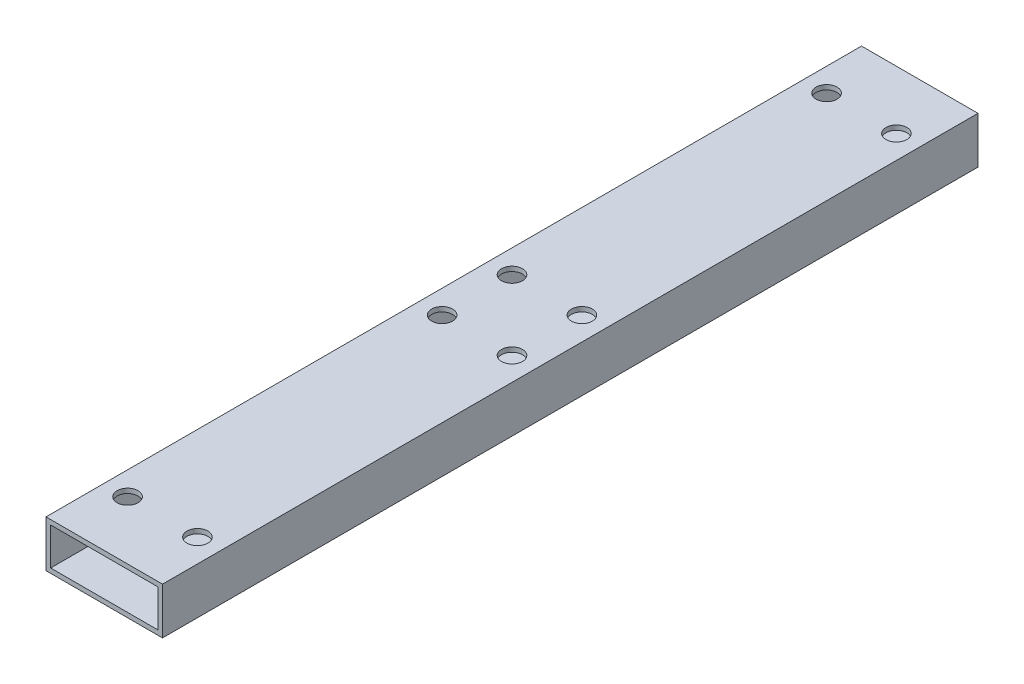
ISO-10303-21;
HEADER;
FILE_DESCRIPTION(('STEP AP214'),'2;1');
FILE_NAME('part.step','',(''),(''),'','','');
FILE_SCHEMA(('AUTOMOTIVE_DESIGN { 1 0 10303 214 1 1 1 1 }'));
ENDSEC;
DATA;
#1=APPLICATION_CONTEXT('core data for automotive mechanical design processes');
#2=APPLICATION_PROTOCOL_DEFINITION('international standard','automotive_design',2000,#1);
#3=PRODUCT_CONTEXT('',#1,'mechanical');
#4=PRODUCT('Part','Part','',(#3));
#5=PRODUCT_RELATED_PRODUCT_CATEGORY('part','',(#4));
#6=PRODUCT_DEFINITION_FORMATION('','',#4);
#7=PRODUCT_DEFINITION_CONTEXT('part definition',#1,'design');
#8=PRODUCT_DEFINITION('design','',#6,#7);
#9=PRODUCT_DEFINITION_SHAPE('','',#8);
#10=(LENGTH_UNIT() NAMED_UNIT(*) SI_UNIT(.MILLI.,.METRE.));
#11=(NAMED_UNIT(*) PLANE_ANGLE_UNIT() SI_UNIT($,.RADIAN.));
#12=(NAMED_UNIT(*) SI_UNIT($,.STERADIAN.) SOLID_ANGLE_UNIT());
#13=UNCERTAINTY_MEASURE_WITH_UNIT(LENGTH_MEASURE(1.E-05),#10,'distance_accuracy_value','');
#14=(GEOMETRIC_REPRESENTATION_CONTEXT(3) GLOBAL_UNCERTAINTY_ASSIGNED_CONTEXT((#13)) GLOBAL_UNIT_ASSIGNED_CONTEXT((#10,
#11,#12)) REPRESENTATION_CONTEXT('',''));
#15=CARTESIAN_POINT('',(0.,0.,0.));
#16=DIRECTION('',(0.,0.,1.));
#17=DIRECTION('',(1.,0.,0.));
#18=AXIS2_PLACEMENT_3D('',#15,#16,#17);
#19=CARTESIAN_POINT('',(25.,-10.,350.));
#20=DIRECTION('',(-1.,0.,0.));
#21=DIRECTION('',(0.,0.,1.));
#22=AXIS2_PLACEMENT_3D('',#19,#20,#21);
#23=PLANE('',#22);
#24=DIRECTION('',(0.,1.,0.));
#25=VECTOR('',#24,1.);
#26=CARTESIAN_POINT('',(25.,-10.,0.));
#27=LINE('',#26,#25);
#28=CARTESIAN_POINT('',(25.,-10.,0.));
#29=VERTEX_POINT('',#28);
#30=CARTESIAN_POINT('',(25.,10.,0.));
#31=VERTEX_POINT('',#30);
#32=EDGE_CURVE('E135',#29,#31,#27,.T.);
#33=ORIENTED_EDGE('',*,*,#32,.T.);
#34=DIRECTION('',(0.,0.,-1.));
#35=VECTOR('',#34,1.);
#36=CARTESIAN_POINT('',(25.,10.,350.));
#37=LINE('',#36,#35);
#38=CARTESIAN_POINT('',(25.,10.,350.));
#39=VERTEX_POINT('',#38);
#40=EDGE_CURVE('E11',#39,#31,#37,.T.);
#41=ORIENTED_EDGE('',*,*,#40,.F.);
#42=DIRECTION('',(0.,1.,0.));
#43=VECTOR('',#42,1.);
#44=CARTESIAN_POINT('',(25.,-10.,350.));
#45=LINE('',#44,#43);
#46=CARTESIAN_POINT('',(25.,-10.,350.));
#47=VERTEX_POINT('',#46);
#48=EDGE_CURVE('E139',#47,#39,#45,.T.);
#49=ORIENTED_EDGE('',*,*,#48,.F.);
#50=DIRECTION('',(0.,0.,-1.));
#51=VECTOR('',#50,1.);
#52=CARTESIAN_POINT('',(25.,-10.,350.));
#53=LINE('',#52,#51);
#54=EDGE_CURVE('E149',#47,#29,#53,.T.);
#55=ORIENTED_EDGE('',*,*,#54,.T.);
#56=EDGE_LOOP('',(#33,#41,#49,#55));
#57=FACE_BOUND('',#56,.T.);
#58=ADVANCED_FACE('F33',(#57),#23,.F.);
#59=CARTESIAN_POINT('',(-25.,10.,350.));
#60=DIRECTION('',(0.,-1.,0.));
#61=DIRECTION('',(0.,0.,-1.));
#62=AXIS2_PLACEMENT_3D('',#59,#60,#61);
#63=PLANE('',#62);
#64=CARTESIAN_POINT('',(-15.,10.,160.));
#65=DIRECTION('',(0.,1.,0.));
#66=DIRECTION('',(0.,0.,1.));
#67=AXIS2_PLACEMENT_3D('',#64,#65,#66);
#68=CIRCLE('',#67,4.5);
#69=CARTESIAN_POINT('',(-15.,10.,164.5));
#70=VERTEX_POINT('',#69);
#71=EDGE_CURVE('E513',#70,#70,#68,.T.);
#72=ORIENTED_EDGE('',*,*,#71,.F.);
#73=EDGE_LOOP('',(#72));
#74=FACE_BOUND('',#73,.T.);
#75=CARTESIAN_POINT('',(-15.,10.,190.));
#76=DIRECTION('',(0.,1.,0.));
#77=DIRECTION('',(0.,0.,1.));
#78=AXIS2_PLACEMENT_3D('',#75,#76,#77);
#79=CIRCLE('',#78,4.5);
#80=CARTESIAN_POINT('',(-15.,10.,194.5));
#81=VERTEX_POINT('',#80);
#82=EDGE_CURVE('E202',#81,#81,#79,.T.);
#83=ORIENTED_EDGE('',*,*,#82,.F.);
#84=EDGE_LOOP('',(#83));
#85=FACE_BOUND('',#84,.T.);
#86=CARTESIAN_POINT('',(15.,10.,190.));
#87=DIRECTION('',(0.,1.,0.));
#88=DIRECTION('',(0.,0.,1.));
#89=AXIS2_PLACEMENT_3D('',#86,#87,#88);
#90=CIRCLE('',#89,4.5);
#91=CARTESIAN_POINT('',(15.,10.,194.5));
#92=VERTEX_POINT('',#91);
#93=EDGE_CURVE('E199',#92,#92,#90,.T.);
#94=ORIENTED_EDGE('',*,*,#93,.F.);
#95=EDGE_LOOP('',(#94));
#96=FACE_BOUND('',#95,.T.);
#97=CARTESIAN_POINT('',(15.,10.,160.));
#98=DIRECTION('',(0.,1.,0.));
#99=DIRECTION('',(0.,0.,1.));
#100=AXIS2_PLACEMENT_3D('',#97,#98,#99);
#101=CIRCLE('',#100,4.5);
#102=CARTESIAN_POINT('',(15.,10.,164.5));
#103=VERTEX_POINT('',#102);
#104=EDGE_CURVE('E218',#103,#103,#101,.T.);
#105=ORIENTED_EDGE('',*,*,#104,.F.);
#106=EDGE_LOOP('',(#105));
#107=FACE_BOUND('',#106,.T.);
#108=CARTESIAN_POINT('',(-15.,10.,25.));
#109=DIRECTION('',(0.,1.,0.));
#110=DIRECTION('',(0.,0.,1.));
#111=AXIS2_PLACEMENT_3D('',#108,#109,#110);
#112=CIRCLE('',#111,4.5);
#113=CARTESIAN_POINT('',(-15.,10.,29.5));
#114=VERTEX_POINT('',#113);
#115=EDGE_CURVE('E225',#114,#114,#112,.T.);
#116=ORIENTED_EDGE('',*,*,#115,.F.);
#117=EDGE_LOOP('',(#116));
#118=FACE_BOUND('',#117,.T.);
#119=CARTESIAN_POINT('',(15.,10.,25.));
#120=DIRECTION('',(0.,1.,0.));
#121=DIRECTION('',(0.,0.,1.));
#122=AXIS2_PLACEMENT_3D('',#119,#120,#121);
#123=CIRCLE('',#122,4.5);
#124=CARTESIAN_POINT('',(15.,10.,29.5));
#125=VERTEX_POINT('',#124);
#126=EDGE_CURVE('E232',#125,#125,#123,.T.);
#127=ORIENTED_EDGE('',*,*,#126,.F.);
#128=EDGE_LOOP('',(#127));
#129=FACE_BOUND('',#128,.T.);
#130=CARTESIAN_POINT('',(-15.,10.,325.));
#131=DIRECTION('',(0.,1.,0.));
#132=DIRECTION('',(0.,0.,1.));
#133=AXIS2_PLACEMENT_3D('',#130,#131,#132);
#134=CIRCLE('',#133,4.5);
#135=CARTESIAN_POINT('',(-15.,10.,329.5));
#136=VERTEX_POINT('',#135);
#137=EDGE_CURVE('E239',#136,#136,#134,.T.);
#138=ORIENTED_EDGE('',*,*,#137,.F.);
#139=EDGE_LOOP('',(#138));
#140=FACE_BOUND('',#139,.T.);
#141=CARTESIAN_POINT('',(15.,10.,325.));
#142=DIRECTION('',(0.,1.,0.));
#143=DIRECTION('',(0.,0.,1.));
#144=AXIS2_PLACEMENT_3D('',#141,#142,#143);
#145=CIRCLE('',#144,4.5);
#146=CARTESIAN_POINT('',(15.,10.,329.5));
#147=VERTEX_POINT('',#146);
#148=EDGE_CURVE('E246',#147,#147,#145,.T.);
#149=ORIENTED_EDGE('',*,*,#148,.F.);
#150=EDGE_LOOP('',(#149));
#151=FACE_BOUND('',#150,.T.);
#152=DIRECTION('',(-1.,0.,0.));
#153=VECTOR('',#152,1.);
#154=CARTESIAN_POINT('',(-25.,10.,0.));
#155=LINE('',#154,#153);
#156=CARTESIAN_POINT('',(-25.,10.,0.));
#157=VERTEX_POINT('',#156);
#158=EDGE_CURVE('E152',#31,#157,#155,.T.);
#159=ORIENTED_EDGE('',*,*,#158,.T.);
#160=DIRECTION('',(0.,0.,-1.));
#161=VECTOR('',#160,1.);
#162=CARTESIAN_POINT('',(-25.,10.,350.));
#163=LINE('',#162,#161);
#164=CARTESIAN_POINT('',(-25.,10.,350.));
#165=VERTEX_POINT('',#164);
#166=EDGE_CURVE('E41',#165,#157,#163,.T.);
#167=ORIENTED_EDGE('',*,*,#166,.F.);
#168=DIRECTION('',(-1.,0.,0.));
#169=VECTOR('',#168,1.);
#170=CARTESIAN_POINT('',(-25.,10.,350.));
#171=LINE('',#170,#169);
#172=EDGE_CURVE('E142',#39,#165,#171,.T.);
#173=ORIENTED_EDGE('',*,*,#172,.F.);
#174=ORIENTED_EDGE('',*,*,#40,.T.);
#175=EDGE_LOOP('',(#159,#167,#173,#174));
#176=FACE_BOUND('',#175,.T.);
#177=ADVANCED_FACE('F254',(#74,#85,#96,#107,#118,#129,#140,#151,#176),#63,.F.);
#178=CARTESIAN_POINT('',(-25.,-10.,350.));
#179=DIRECTION('',(1.,0.,0.));
#180=DIRECTION('',(0.,0.,-1.));
#181=AXIS2_PLACEMENT_3D('',#178,#179,#180);
#182=PLANE('',#181);
#183=DIRECTION('',(0.,-1.,0.));
#184=VECTOR('',#183,1.);
#185=CARTESIAN_POINT('',(-25.,-10.,0.));
#186=LINE('',#185,#184);
#187=CARTESIAN_POINT('',(-25.,-10.,0.));
#188=VERTEX_POINT('',#187);
#189=EDGE_CURVE('E154',#157,#188,#186,.T.);
#190=ORIENTED_EDGE('',*,*,#189,.T.);
#191=DIRECTION('',(0.,0.,-1.));
#192=VECTOR('',#191,1.);
#193=CARTESIAN_POINT('',(-25.,-10.,350.));
#194=LINE('',#193,#192);
#195=CARTESIAN_POINT('',(-25.,-10.,350.));
#196=VERTEX_POINT('',#195);
#197=EDGE_CURVE('E159',#196,#188,#194,.T.);
#198=ORIENTED_EDGE('',*,*,#197,.F.);
#199=DIRECTION('',(0.,-1.,0.));
#200=VECTOR('',#199,1.);
#201=CARTESIAN_POINT('',(-25.,-10.,350.));
#202=LINE('',#201,#200);
#203=EDGE_CURVE('E145',#165,#196,#202,.T.);
#204=ORIENTED_EDGE('',*,*,#203,.F.);
#205=ORIENTED_EDGE('',*,*,#166,.T.);
#206=EDGE_LOOP('',(#190,#198,#204,#205));
#207=FACE_BOUND('',#206,.T.);
#208=ADVANCED_FACE('F257',(#207),#182,.F.);
#209=CARTESIAN_POINT('',(-25.,-10.,350.));
#210=DIRECTION('',(0.,1.,0.));
#211=DIRECTION('',(0.,0.,1.));
#212=AXIS2_PLACEMENT_3D('',#209,#210,#211);
#213=PLANE('',#212);
#214=CARTESIAN_POINT('',(-15.,-10.,160.));
#215=DIRECTION('',(0.,1.,0.));
#216=DIRECTION('',(0.,0.,1.));
#217=AXIS2_PLACEMENT_3D('',#214,#215,#216);
#218=CIRCLE('',#217,4.5);
#219=CARTESIAN_POINT('',(-15.,-10.,164.5));
#220=VERTEX_POINT('',#219);
#221=EDGE_CURVE('E508',#220,#220,#218,.T.);
#222=ORIENTED_EDGE('',*,*,#221,.T.);
#223=EDGE_LOOP('',(#222));
#224=FACE_BOUND('',#223,.T.);
#225=CARTESIAN_POINT('',(-15.,-10.,190.));
#226=DIRECTION('',(0.,1.,0.));
#227=DIRECTION('',(0.,0.,1.));
#228=AXIS2_PLACEMENT_3D('',#225,#226,#227);
#229=CIRCLE('',#228,4.5);
#230=CARTESIAN_POINT('',(-15.,-10.,194.5));
#231=VERTEX_POINT('',#230);
#232=EDGE_CURVE('E195',#231,#231,#229,.T.);
#233=ORIENTED_EDGE('',*,*,#232,.T.);
#234=EDGE_LOOP('',(#233));
#235=FACE_BOUND('',#234,.T.);
#236=CARTESIAN_POINT('',(15.,-10.,190.));
#237=DIRECTION('',(0.,1.,0.));
#238=DIRECTION('',(0.,0.,1.));
#239=AXIS2_PLACEMENT_3D('',#236,#237,#238);
#240=CIRCLE('',#239,4.5);
#241=CARTESIAN_POINT('',(15.,-10.,194.5));
#242=VERTEX_POINT('',#241);
#243=EDGE_CURVE('E191',#242,#242,#240,.T.);
#244=ORIENTED_EDGE('',*,*,#243,.T.);
#245=EDGE_LOOP('',(#244));
#246=FACE_BOUND('',#245,.T.);
#247=CARTESIAN_POINT('',(15.,-10.,160.));
#248=DIRECTION('',(0.,1.,0.));
#249=DIRECTION('',(0.,0.,1.));
#250=AXIS2_PLACEMENT_3D('',#247,#248,#249);
#251=CIRCLE('',#250,4.5);
#252=CARTESIAN_POINT('',(15.,-10.,164.5));
#253=VERTEX_POINT('',#252);
#254=EDGE_CURVE('E187',#253,#253,#251,.T.);
#255=ORIENTED_EDGE('',*,*,#254,.T.);
#256=EDGE_LOOP('',(#255));
#257=FACE_BOUND('',#256,.T.);
#258=CARTESIAN_POINT('',(-15.,-10.,25.));
#259=DIRECTION('',(0.,1.,0.));
#260=DIRECTION('',(0.,0.,1.));
#261=AXIS2_PLACEMENT_3D('',#258,#259,#260);
#262=CIRCLE('',#261,4.5);
#263=CARTESIAN_POINT('',(-15.,-10.,29.5));
#264=VERTEX_POINT('',#263);
#265=EDGE_CURVE('E182',#264,#264,#262,.T.);
#266=ORIENTED_EDGE('',*,*,#265,.T.);
#267=EDGE_LOOP('',(#266));
#268=FACE_BOUND('',#267,.T.);
#269=CARTESIAN_POINT('',(15.,-10.,25.));
#270=DIRECTION('',(0.,1.,0.));
#271=DIRECTION('',(0.,0.,1.));
#272=AXIS2_PLACEMENT_3D('',#269,#270,#271);
#273=CIRCLE('',#272,4.5);
#274=CARTESIAN_POINT('',(15.,-10.,29.5));
#275=VERTEX_POINT('',#274);
#276=EDGE_CURVE('E177',#275,#275,#273,.T.);
#277=ORIENTED_EDGE('',*,*,#276,.T.);
#278=EDGE_LOOP('',(#277));
#279=FACE_BOUND('',#278,.T.);
#280=CARTESIAN_POINT('',(-15.,-10.,325.));
#281=DIRECTION('',(0.,1.,0.));
#282=DIRECTION('',(0.,0.,1.));
#283=AXIS2_PLACEMENT_3D('',#280,#281,#282);
#284=CIRCLE('',#283,4.5);
#285=CARTESIAN_POINT('',(-15.,-10.,329.5));
#286=VERTEX_POINT('',#285);
#287=EDGE_CURVE('E172',#286,#286,#284,.T.);
#288=ORIENTED_EDGE('',*,*,#287,.T.);
#289=EDGE_LOOP('',(#288));
#290=FACE_BOUND('',#289,.T.);
#291=CARTESIAN_POINT('',(15.,-10.,325.));
#292=DIRECTION('',(0.,1.,0.));
#293=DIRECTION('',(0.,0.,1.));
#294=AXIS2_PLACEMENT_3D('',#291,#292,#293);
#295=CIRCLE('',#294,4.5);
#296=CARTESIAN_POINT('',(15.,-10.,329.5));
#297=VERTEX_POINT('',#296);
#298=EDGE_CURVE('E167',#297,#297,#295,.T.);
#299=ORIENTED_EDGE('',*,*,#298,.T.);
#300=EDGE_LOOP('',(#299));
#301=FACE_BOUND('',#300,.T.);
#302=DIRECTION('',(1.,0.,0.));
#303=VECTOR('',#302,1.);
#304=CARTESIAN_POINT('',(-25.,-10.,0.));
#305=LINE('',#304,#303);
#306=EDGE_CURVE('E143',#188,#29,#305,.T.);
#307=ORIENTED_EDGE('',*,*,#306,.T.);
#308=ORIENTED_EDGE('',*,*,#54,.F.);
#309=DIRECTION('',(1.,0.,0.));
#310=VECTOR('',#309,1.);
#311=CARTESIAN_POINT('',(-25.,-10.,350.));
#312=LINE('',#311,#310);
#313=EDGE_CURVE('E147',#196,#47,#312,.T.);
#314=ORIENTED_EDGE('',*,*,#313,.F.);
#315=ORIENTED_EDGE('',*,*,#197,.T.);
#316=EDGE_LOOP('',(#307,#308,#314,#315));
#317=FACE_BOUND('',#316,.T.);
#318=ADVANCED_FACE('F269',(#224,#235,#246,#257,#268,#279,#290,#301,#317),#213,.F.);
#319=CARTESIAN_POINT('',(25.,10.,350.));
#320=DIRECTION('',(0.,0.,-1.));
#321=DIRECTION('',(-1.,0.,0.));
#322=AXIS2_PLACEMENT_3D('',#319,#320,#321);
#323=PLANE('',#322);
#324=DIRECTION('',(-1.,0.,0.));
#325=VECTOR('',#324,1.);
#326=CARTESIAN_POINT('',(-23.,8.,350.));
#327=LINE('',#326,#325);
#328=CARTESIAN_POINT('',(23.,8.,350.));
#329=VERTEX_POINT('',#328);
#330=CARTESIAN_POINT('',(-23.,8.,350.));
#331=VERTEX_POINT('',#330);
#332=EDGE_CURVE('E129',#329,#331,#327,.T.);
#333=ORIENTED_EDGE('',*,*,#332,.F.);
#334=DIRECTION('',(0.,1.,0.));
#335=VECTOR('',#334,1.);
#336=CARTESIAN_POINT('',(23.,-8.,350.));
#337=LINE('',#336,#335);
#338=CARTESIAN_POINT('',(23.,-8.,350.));
#339=VERTEX_POINT('',#338);
#340=EDGE_CURVE('E49',#339,#329,#337,.T.);
#341=ORIENTED_EDGE('',*,*,#340,.F.);
#342=DIRECTION('',(1.,0.,0.));
#343=VECTOR('',#342,1.);
#344=CARTESIAN_POINT('',(-23.,-8.,350.));
#345=LINE('',#344,#343);
#346=CARTESIAN_POINT('',(-23.,-8.,350.));
#347=VERTEX_POINT('',#346);
#348=EDGE_CURVE('E117',#347,#339,#345,.T.);
#349=ORIENTED_EDGE('',*,*,#348,.F.);
#350=DIRECTION('',(0.,-1.,0.));
#351=VECTOR('',#350,1.);
#352=CARTESIAN_POINT('',(-23.,-8.,350.));
#353=LINE('',#352,#351);
#354=EDGE_CURVE('E120',#331,#347,#353,.T.);
#355=ORIENTED_EDGE('',*,*,#354,.F.);
#356=EDGE_LOOP('',(#333,#341,#349,#355));
#357=FACE_BOUND('',#356,.T.);
#358=ORIENTED_EDGE('',*,*,#48,.T.);
#359=ORIENTED_EDGE('',*,*,#172,.T.);
#360=ORIENTED_EDGE('',*,*,#203,.T.);
#361=ORIENTED_EDGE('',*,*,#313,.T.);
#362=EDGE_LOOP('',(#358,#359,#360,#361));
#363=FACE_BOUND('',#362,.T.);
#364=ADVANCED_FACE('F274',(#357,#363),#323,.F.);
#365=CARTESIAN_POINT('',(25.,10.,0.));
#366=DIRECTION('',(0.,0.,-1.));
#367=DIRECTION('',(-1.,0.,0.));
#368=AXIS2_PLACEMENT_3D('',#365,#366,#367);
#369=PLANE('',#368);
#370=DIRECTION('',(0.,1.,0.));
#371=VECTOR('',#370,1.);
#372=CARTESIAN_POINT('',(23.,-8.,0.));
#373=LINE('',#372,#371);
#374=CARTESIAN_POINT('',(23.,-8.,0.));
#375=VERTEX_POINT('',#374);
#376=CARTESIAN_POINT('',(23.,8.,0.));
#377=VERTEX_POINT('',#376);
#378=EDGE_CURVE('E101',#375,#377,#373,.T.);
#379=ORIENTED_EDGE('',*,*,#378,.T.);
#380=DIRECTION('',(-1.,0.,0.));
#381=VECTOR('',#380,1.);
#382=CARTESIAN_POINT('',(-23.,8.,0.));
#383=LINE('',#382,#381);
#384=CARTESIAN_POINT('',(-23.,8.,0.));
#385=VERTEX_POINT('',#384);
#386=EDGE_CURVE('E110',#377,#385,#383,.T.);
#387=ORIENTED_EDGE('',*,*,#386,.T.);
#388=DIRECTION('',(0.,-1.,0.));
#389=VECTOR('',#388,1.);
#390=CARTESIAN_POINT('',(-23.,-8.,0.));
#391=LINE('',#390,#389);
#392=CARTESIAN_POINT('',(-23.,-8.,0.));
#393=VERTEX_POINT('',#392);
#394=EDGE_CURVE('E57',#385,#393,#391,.T.);
#395=ORIENTED_EDGE('',*,*,#394,.T.);
#396=DIRECTION('',(1.,0.,0.));
#397=VECTOR('',#396,1.);
#398=CARTESIAN_POINT('',(-23.,-8.,0.));
#399=LINE('',#398,#397);
#400=EDGE_CURVE('E107',#393,#375,#399,.T.);
#401=ORIENTED_EDGE('',*,*,#400,.T.);
#402=EDGE_LOOP('',(#379,#387,#395,#401));
#403=FACE_BOUND('',#402,.T.);
#404=ORIENTED_EDGE('',*,*,#32,.F.);
#405=ORIENTED_EDGE('',*,*,#306,.F.);
#406=ORIENTED_EDGE('',*,*,#189,.F.);
#407=ORIENTED_EDGE('',*,*,#158,.F.);
#408=EDGE_LOOP('',(#404,#405,#406,#407));
#409=FACE_BOUND('',#408,.T.);
#410=ADVANCED_FACE('F114',(#403,#409),#369,.T.);
#411=CARTESIAN_POINT('',(23.,-8.,0.));
#412=DIRECTION('',(1.,0.,0.));
#413=DIRECTION('',(0.,0.,-1.));
#414=AXIS2_PLACEMENT_3D('',#411,#412,#413);
#415=PLANE('',#414);
#416=ORIENTED_EDGE('',*,*,#340,.T.);
#417=DIRECTION('',(0.,0.,1.));
#418=VECTOR('',#417,1.);
#419=CARTESIAN_POINT('',(23.,8.,0.));
#420=LINE('',#419,#418);
#421=EDGE_CURVE('E97',#377,#329,#420,.T.);
#422=ORIENTED_EDGE('',*,*,#421,.F.);
#423=ORIENTED_EDGE('',*,*,#378,.F.);
#424=DIRECTION('',(0.,0.,1.));
#425=VECTOR('',#424,1.);
#426=CARTESIAN_POINT('',(23.,-8.,0.));
#427=LINE('',#426,#425);
#428=EDGE_CURVE('E133',#375,#339,#427,.T.);
#429=ORIENTED_EDGE('',*,*,#428,.T.);
#430=EDGE_LOOP('',(#416,#422,#423,#429));
#431=FACE_BOUND('',#430,.T.);
#432=ADVANCED_FACE('F99',(#431),#415,.F.);
#433=CARTESIAN_POINT('',(-23.,-8.,0.));
#434=DIRECTION('',(0.,-1.,0.));
#435=DIRECTION('',(0.,0.,-1.));
#436=AXIS2_PLACEMENT_3D('',#433,#434,#435);
#437=PLANE('',#436);
#438=CARTESIAN_POINT('',(-15.,-8.,160.));
#439=DIRECTION('',(0.,-1.,0.));
#440=DIRECTION('',(0.,0.,-1.));
#441=AXIS2_PLACEMENT_3D('',#438,#439,#440);
#442=CIRCLE('',#441,4.5);
#443=CARTESIAN_POINT('',(-15.,-8.,155.5));
#444=VERTEX_POINT('',#443);
#445=EDGE_CURVE('E207',#444,#444,#442,.T.);
#446=ORIENTED_EDGE('',*,*,#445,.T.);
#447=EDGE_LOOP('',(#446));
#448=FACE_BOUND('',#447,.T.);
#449=CARTESIAN_POINT('',(-15.,-8.,190.));
#450=DIRECTION('',(0.,-1.,0.));
#451=DIRECTION('',(0.,0.,-1.));
#452=AXIS2_PLACEMENT_3D('',#449,#450,#451);
#453=CIRCLE('',#452,4.5);
#454=CARTESIAN_POINT('',(-15.,-8.,185.5));
#455=VERTEX_POINT('',#454);
#456=EDGE_CURVE('E194',#455,#455,#453,.T.);
#457=ORIENTED_EDGE('',*,*,#456,.T.);
#458=EDGE_LOOP('',(#457));
#459=FACE_BOUND('',#458,.T.);
#460=CARTESIAN_POINT('',(15.,-8.,190.));
#461=DIRECTION('',(0.,-1.,0.));
#462=DIRECTION('',(0.,0.,-1.));
#463=AXIS2_PLACEMENT_3D('',#460,#461,#462);
#464=CIRCLE('',#463,4.5);
#465=CARTESIAN_POINT('',(15.,-8.,185.5));
#466=VERTEX_POINT('',#465);
#467=EDGE_CURVE('E190',#466,#466,#464,.T.);
#468=ORIENTED_EDGE('',*,*,#467,.T.);
#469=EDGE_LOOP('',(#468));
#470=FACE_BOUND('',#469,.T.);
#471=CARTESIAN_POINT('',(15.,-8.,160.));
#472=DIRECTION('',(0.,-1.,0.));
#473=DIRECTION('',(0.,0.,-1.));
#474=AXIS2_PLACEMENT_3D('',#471,#472,#473);
#475=CIRCLE('',#474,4.5);
#476=CARTESIAN_POINT('',(15.,-8.,155.5));
#477=VERTEX_POINT('',#476);
#478=EDGE_CURVE('E186',#477,#477,#475,.T.);
#479=ORIENTED_EDGE('',*,*,#478,.T.);
#480=EDGE_LOOP('',(#479));
#481=FACE_BOUND('',#480,.T.);
#482=CARTESIAN_POINT('',(-15.,-8.,25.));
#483=DIRECTION('',(0.,-1.,0.));
#484=DIRECTION('',(0.,0.,-1.));
#485=AXIS2_PLACEMENT_3D('',#482,#483,#484);
#486=CIRCLE('',#485,4.5);
#487=CARTESIAN_POINT('',(-15.,-8.,20.5));
#488=VERTEX_POINT('',#487);
#489=EDGE_CURVE('E181',#488,#488,#486,.T.);
#490=ORIENTED_EDGE('',*,*,#489,.T.);
#491=EDGE_LOOP('',(#490));
#492=FACE_BOUND('',#491,.T.);
#493=CARTESIAN_POINT('',(15.,-8.,25.));
#494=DIRECTION('',(0.,-1.,0.));
#495=DIRECTION('',(0.,0.,-1.));
#496=AXIS2_PLACEMENT_3D('',#493,#494,#495);
#497=CIRCLE('',#496,4.5);
#498=CARTESIAN_POINT('',(15.,-8.,20.5));
#499=VERTEX_POINT('',#498);
#500=EDGE_CURVE('E176',#499,#499,#497,.T.);
#501=ORIENTED_EDGE('',*,*,#500,.T.);
#502=EDGE_LOOP('',(#501));
#503=FACE_BOUND('',#502,.T.);
#504=CARTESIAN_POINT('',(-15.,-8.,325.));
#505=DIRECTION('',(0.,-1.,0.));
#506=DIRECTION('',(0.,0.,-1.));
#507=AXIS2_PLACEMENT_3D('',#504,#505,#506);
#508=CIRCLE('',#507,4.5);
#509=CARTESIAN_POINT('',(-15.,-8.,320.5));
#510=VERTEX_POINT('',#509);
#511=EDGE_CURVE('E171',#510,#510,#508,.T.);
#512=ORIENTED_EDGE('',*,*,#511,.T.);
#513=EDGE_LOOP('',(#512));
#514=FACE_BOUND('',#513,.T.);
#515=CARTESIAN_POINT('',(15.,-8.,325.));
#516=DIRECTION('',(0.,-1.,0.));
#517=DIRECTION('',(0.,0.,-1.));
#518=AXIS2_PLACEMENT_3D('',#515,#516,#517);
#519=CIRCLE('',#518,4.5);
#520=CARTESIAN_POINT('',(15.,-8.,320.5));
#521=VERTEX_POINT('',#520);
#522=EDGE_CURVE('E123',#521,#521,#519,.T.);
#523=ORIENTED_EDGE('',*,*,#522,.T.);
#524=EDGE_LOOP('',(#523));
#525=FACE_BOUND('',#524,.T.);
#526=ORIENTED_EDGE('',*,*,#348,.T.);
#527=ORIENTED_EDGE('',*,*,#428,.F.);
#528=ORIENTED_EDGE('',*,*,#400,.F.);
#529=DIRECTION('',(0.,0.,1.));
#530=VECTOR('',#529,1.);
#531=CARTESIAN_POINT('',(-23.,-8.,0.));
#532=LINE('',#531,#530);
#533=EDGE_CURVE('E136',#393,#347,#532,.T.);
#534=ORIENTED_EDGE('',*,*,#533,.T.);
#535=EDGE_LOOP('',(#526,#527,#528,#534));
#536=FACE_BOUND('',#535,.T.);
#537=ADVANCED_FACE('F310',(#448,#459,#470,#481,#492,#503,#514,#525,#536),#437,.F.);
#538=CARTESIAN_POINT('',(-23.,-8.,0.));
#539=DIRECTION('',(-1.,0.,0.));
#540=DIRECTION('',(0.,0.,1.));
#541=AXIS2_PLACEMENT_3D('',#538,#539,#540);
#542=PLANE('',#541);
#543=ORIENTED_EDGE('',*,*,#354,.T.);
#544=ORIENTED_EDGE('',*,*,#533,.F.);
#545=ORIENTED_EDGE('',*,*,#394,.F.);
#546=DIRECTION('',(0.,0.,1.));
#547=VECTOR('',#546,1.);
#548=CARTESIAN_POINT('',(-23.,8.,0.));
#549=LINE('',#548,#547);
#550=EDGE_CURVE('E106',#385,#331,#549,.T.);
#551=ORIENTED_EDGE('',*,*,#550,.T.);
#552=EDGE_LOOP('',(#543,#544,#545,#551));
#553=FACE_BOUND('',#552,.T.);
#554=ADVANCED_FACE('F315',(#553),#542,.F.);
#555=CARTESIAN_POINT('',(-23.,8.,0.));
#556=DIRECTION('',(0.,1.,0.));
#557=DIRECTION('',(0.,0.,1.));
#558=AXIS2_PLACEMENT_3D('',#555,#556,#557);
#559=PLANE('',#558);
#560=CARTESIAN_POINT('',(-15.,8.,160.));
#561=DIRECTION('',(0.,1.,0.));
#562=DIRECTION('',(0.,0.,1.));
#563=AXIS2_PLACEMENT_3D('',#560,#561,#562);
#564=CIRCLE('',#563,4.5);
#565=CARTESIAN_POINT('',(-15.,8.,164.5));
#566=VERTEX_POINT('',#565);
#567=EDGE_CURVE('E36',#566,#566,#564,.T.);
#568=ORIENTED_EDGE('',*,*,#567,.T.);
#569=EDGE_LOOP('',(#568));
#570=FACE_BOUND('',#569,.T.);
#571=CARTESIAN_POINT('',(-15.,8.,190.));
#572=DIRECTION('',(0.,1.,0.));
#573=DIRECTION('',(0.,0.,1.));
#574=AXIS2_PLACEMENT_3D('',#571,#572,#573);
#575=CIRCLE('',#574,4.5);
#576=CARTESIAN_POINT('',(-15.,8.,194.5));
#577=VERTEX_POINT('',#576);
#578=EDGE_CURVE('E192',#577,#577,#575,.T.);
#579=ORIENTED_EDGE('',*,*,#578,.T.);
#580=EDGE_LOOP('',(#579));
#581=FACE_BOUND('',#580,.T.);
#582=CARTESIAN_POINT('',(15.,8.,190.));
#583=DIRECTION('',(0.,1.,0.));
#584=DIRECTION('',(0.,0.,1.));
#585=AXIS2_PLACEMENT_3D('',#582,#583,#584);
#586=CIRCLE('',#585,4.5);
#587=CARTESIAN_POINT('',(15.,8.,194.5));
#588=VERTEX_POINT('',#587);
#589=EDGE_CURVE('E188',#588,#588,#586,.T.);
#590=ORIENTED_EDGE('',*,*,#589,.T.);
#591=EDGE_LOOP('',(#590));
#592=FACE_BOUND('',#591,.T.);
#593=CARTESIAN_POINT('',(15.,8.,160.));
#594=DIRECTION('',(0.,1.,0.));
#595=DIRECTION('',(0.,0.,1.));
#596=AXIS2_PLACEMENT_3D('',#593,#594,#595);
#597=CIRCLE('',#596,4.5);
#598=CARTESIAN_POINT('',(15.,8.,164.5));
#599=VERTEX_POINT('',#598);
#600=EDGE_CURVE('E183',#599,#599,#597,.T.);
#601=ORIENTED_EDGE('',*,*,#600,.T.);
#602=EDGE_LOOP('',(#601));
#603=FACE_BOUND('',#602,.T.);
#604=CARTESIAN_POINT('',(-15.,8.,25.));
#605=DIRECTION('',(0.,1.,0.));
#606=DIRECTION('',(0.,0.,1.));
#607=AXIS2_PLACEMENT_3D('',#604,#605,#606);
#608=CIRCLE('',#607,4.5);
#609=CARTESIAN_POINT('',(-15.,8.,29.5));
#610=VERTEX_POINT('',#609);
#611=EDGE_CURVE('E178',#610,#610,#608,.T.);
#612=ORIENTED_EDGE('',*,*,#611,.T.);
#613=EDGE_LOOP('',(#612));
#614=FACE_BOUND('',#613,.T.);
#615=CARTESIAN_POINT('',(15.,8.,25.));
#616=DIRECTION('',(0.,1.,0.));
#617=DIRECTION('',(0.,0.,1.));
#618=AXIS2_PLACEMENT_3D('',#615,#616,#617);
#619=CIRCLE('',#618,4.5);
#620=CARTESIAN_POINT('',(15.,8.,29.5));
#621=VERTEX_POINT('',#620);
#622=EDGE_CURVE('E173',#621,#621,#619,.T.);
#623=ORIENTED_EDGE('',*,*,#622,.T.);
#624=EDGE_LOOP('',(#623));
#625=FACE_BOUND('',#624,.T.);
#626=CARTESIAN_POINT('',(-15.,8.,325.));
#627=DIRECTION('',(0.,1.,0.));
#628=DIRECTION('',(0.,0.,1.));
#629=AXIS2_PLACEMENT_3D('',#626,#627,#628);
#630=CIRCLE('',#629,4.5);
#631=CARTESIAN_POINT('',(-15.,8.,329.5));
#632=VERTEX_POINT('',#631);
#633=EDGE_CURVE('E168',#632,#632,#630,.T.);
#634=ORIENTED_EDGE('',*,*,#633,.T.);
#635=EDGE_LOOP('',(#634));
#636=FACE_BOUND('',#635,.T.);
#637=CARTESIAN_POINT('',(15.,8.,325.));
#638=DIRECTION('',(0.,1.,0.));
#639=DIRECTION('',(0.,0.,1.));
#640=AXIS2_PLACEMENT_3D('',#637,#638,#639);
#641=CIRCLE('',#640,4.5);
#642=CARTESIAN_POINT('',(15.,8.,329.5));
#643=VERTEX_POINT('',#642);
#644=EDGE_CURVE('E164',#643,#643,#641,.T.);
#645=ORIENTED_EDGE('',*,*,#644,.T.);
#646=EDGE_LOOP('',(#645));
#647=FACE_BOUND('',#646,.T.);
#648=ORIENTED_EDGE('',*,*,#332,.T.);
#649=ORIENTED_EDGE('',*,*,#550,.F.);
#650=ORIENTED_EDGE('',*,*,#386,.F.);
#651=ORIENTED_EDGE('',*,*,#421,.T.);
#652=EDGE_LOOP('',(#648,#649,#650,#651));
#653=FACE_BOUND('',#652,.T.);
#654=ADVANCED_FACE('F111',(#570,#581,#592,#603,#614,#625,#636,#647,#653),#559,.F.);
#655=CARTESIAN_POINT('',(15.,-10.,325.));
#656=DIRECTION('',(0.,1.,0.));
#657=DIRECTION('',(0.,0.,1.));
#658=AXIS2_PLACEMENT_3D('',#655,#656,#657);
#659=CYLINDRICAL_SURFACE('',#658,4.5);
#660=ORIENTED_EDGE('',*,*,#148,.T.);
#661=EDGE_LOOP('',(#660));
#662=FACE_BOUND('',#661,.T.);
#663=ORIENTED_EDGE('',*,*,#644,.F.);
#664=EDGE_LOOP('',(#663));
#665=FACE_BOUND('',#664,.T.);
#666=ADVANCED_FACE('F251',(#662,#665),#659,.F.);
#667=ORIENTED_EDGE('',*,*,#298,.F.);
#668=EDGE_LOOP('',(#667));
#669=FACE_BOUND('',#668,.T.);
#670=ORIENTED_EDGE('',*,*,#522,.F.);
#671=EDGE_LOOP('',(#670));
#672=FACE_BOUND('',#671,.T.);
#673=ADVANCED_FACE('F338',(#669,#672),#659,.F.);
#674=CARTESIAN_POINT('',(-15.,-10.,325.));
#675=DIRECTION('',(0.,1.,0.));
#676=DIRECTION('',(0.,0.,1.));
#677=AXIS2_PLACEMENT_3D('',#674,#675,#676);
#678=CYLINDRICAL_SURFACE('',#677,4.5);
#679=ORIENTED_EDGE('',*,*,#137,.T.);
#680=EDGE_LOOP('',(#679));
#681=FACE_BOUND('',#680,.T.);
#682=ORIENTED_EDGE('',*,*,#633,.F.);
#683=EDGE_LOOP('',(#682));
#684=FACE_BOUND('',#683,.T.);
#685=ADVANCED_FACE('F347',(#681,#684),#678,.F.);
#686=ORIENTED_EDGE('',*,*,#287,.F.);
#687=EDGE_LOOP('',(#686));
#688=FACE_BOUND('',#687,.T.);
#689=ORIENTED_EDGE('',*,*,#511,.F.);
#690=EDGE_LOOP('',(#689));
#691=FACE_BOUND('',#690,.T.);
#692=ADVANCED_FACE('F356',(#688,#691),#678,.F.);
#693=CARTESIAN_POINT('',(15.,-10.,25.));
#694=DIRECTION('',(0.,1.,0.));
#695=DIRECTION('',(0.,0.,1.));
#696=AXIS2_PLACEMENT_3D('',#693,#694,#695);
#697=CYLINDRICAL_SURFACE('',#696,4.5);
#698=ORIENTED_EDGE('',*,*,#126,.T.);
#699=EDGE_LOOP('',(#698));
#700=FACE_BOUND('',#699,.T.);
#701=ORIENTED_EDGE('',*,*,#622,.F.);
#702=EDGE_LOOP('',(#701));
#703=FACE_BOUND('',#702,.T.);
#704=ADVANCED_FACE('F366',(#700,#703),#697,.F.);
#705=ORIENTED_EDGE('',*,*,#276,.F.);
#706=EDGE_LOOP('',(#705));
#707=FACE_BOUND('',#706,.T.);
#708=ORIENTED_EDGE('',*,*,#500,.F.);
#709=EDGE_LOOP('',(#708));
#710=FACE_BOUND('',#709,.T.);
#711=ADVANCED_FACE('F375',(#707,#710),#697,.F.);
#712=CARTESIAN_POINT('',(-15.,-10.,25.));
#713=DIRECTION('',(0.,1.,0.));
#714=DIRECTION('',(0.,0.,1.));
#715=AXIS2_PLACEMENT_3D('',#712,#713,#714);
#716=CYLINDRICAL_SURFACE('',#715,4.5);
#717=ORIENTED_EDGE('',*,*,#115,.T.);
#718=EDGE_LOOP('',(#717));
#719=FACE_BOUND('',#718,.T.);
#720=ORIENTED_EDGE('',*,*,#611,.F.);
#721=EDGE_LOOP('',(#720));
#722=FACE_BOUND('',#721,.T.);
#723=ADVANCED_FACE('F385',(#719,#722),#716,.F.);
#724=ORIENTED_EDGE('',*,*,#265,.F.);
#725=EDGE_LOOP('',(#724));
#726=FACE_BOUND('',#725,.T.);
#727=ORIENTED_EDGE('',*,*,#489,.F.);
#728=EDGE_LOOP('',(#727));
#729=FACE_BOUND('',#728,.T.);
#730=ADVANCED_FACE('F394',(#726,#729),#716,.F.);
#731=CARTESIAN_POINT('',(15.,-10.,160.));
#732=DIRECTION('',(0.,1.,0.));
#733=DIRECTION('',(0.,0.,1.));
#734=AXIS2_PLACEMENT_3D('',#731,#732,#733);
#735=CYLINDRICAL_SURFACE('',#734,4.5);
#736=ORIENTED_EDGE('',*,*,#104,.T.);
#737=EDGE_LOOP('',(#736));
#738=FACE_BOUND('',#737,.T.);
#739=ORIENTED_EDGE('',*,*,#600,.F.);
#740=EDGE_LOOP('',(#739));
#741=FACE_BOUND('',#740,.T.);
#742=ADVANCED_FACE('F404',(#738,#741),#735,.F.);
#743=ORIENTED_EDGE('',*,*,#254,.F.);
#744=EDGE_LOOP('',(#743));
#745=FACE_BOUND('',#744,.T.);
#746=ORIENTED_EDGE('',*,*,#478,.F.);
#747=EDGE_LOOP('',(#746));
#748=FACE_BOUND('',#747,.T.);
#749=ADVANCED_FACE('F413',(#745,#748),#735,.F.);
#750=CARTESIAN_POINT('',(15.,-10.,190.));
#751=DIRECTION('',(0.,1.,0.));
#752=DIRECTION('',(0.,0.,1.));
#753=AXIS2_PLACEMENT_3D('',#750,#751,#752);
#754=CYLINDRICAL_SURFACE('',#753,4.5);
#755=ORIENTED_EDGE('',*,*,#93,.T.);
#756=EDGE_LOOP('',(#755));
#757=FACE_BOUND('',#756,.T.);
#758=ORIENTED_EDGE('',*,*,#589,.F.);
#759=EDGE_LOOP('',(#758));
#760=FACE_BOUND('',#759,.T.);
#761=ADVANCED_FACE('F423',(#757,#760),#754,.F.);
#762=ORIENTED_EDGE('',*,*,#243,.F.);
#763=EDGE_LOOP('',(#762));
#764=FACE_BOUND('',#763,.T.);
#765=ORIENTED_EDGE('',*,*,#467,.F.);
#766=EDGE_LOOP('',(#765));
#767=FACE_BOUND('',#766,.T.);
#768=ADVANCED_FACE('F432',(#764,#767),#754,.F.);
#769=CARTESIAN_POINT('',(-15.,-10.,190.));
#770=DIRECTION('',(0.,1.,0.));
#771=DIRECTION('',(0.,0.,1.));
#772=AXIS2_PLACEMENT_3D('',#769,#770,#771);
#773=CYLINDRICAL_SURFACE('',#772,4.5);
#774=ORIENTED_EDGE('',*,*,#82,.T.);
#775=EDGE_LOOP('',(#774));
#776=FACE_BOUND('',#775,.T.);
#777=ORIENTED_EDGE('',*,*,#578,.F.);
#778=EDGE_LOOP('',(#777));
#779=FACE_BOUND('',#778,.T.);
#780=ADVANCED_FACE('F442',(#776,#779),#773,.F.);
#781=ORIENTED_EDGE('',*,*,#232,.F.);
#782=EDGE_LOOP('',(#781));
#783=FACE_BOUND('',#782,.T.);
#784=ORIENTED_EDGE('',*,*,#456,.F.);
#785=EDGE_LOOP('',(#784));
#786=FACE_BOUND('',#785,.T.);
#787=ADVANCED_FACE('F451',(#783,#786),#773,.F.);
#788=CARTESIAN_POINT('',(-15.,-10.,160.));
#789=DIRECTION('',(0.,1.,0.));
#790=DIRECTION('',(0.,0.,1.));
#791=AXIS2_PLACEMENT_3D('',#788,#789,#790);
#792=CYLINDRICAL_SURFACE('',#791,4.5);
#793=ORIENTED_EDGE('',*,*,#71,.T.);
#794=EDGE_LOOP('',(#793));
#795=FACE_BOUND('',#794,.T.);
#796=ORIENTED_EDGE('',*,*,#567,.F.);
#797=EDGE_LOOP('',(#796));
#798=FACE_BOUND('',#797,.T.);
#799=ADVANCED_FACE('F461',(#795,#798),#792,.F.);
#800=ORIENTED_EDGE('',*,*,#221,.F.);
#801=EDGE_LOOP('',(#800));
#802=FACE_BOUND('',#801,.T.);
#803=ORIENTED_EDGE('',*,*,#445,.F.);
#804=EDGE_LOOP('',(#803));
#805=FACE_BOUND('',#804,.T.);
#806=ADVANCED_FACE('F470',(#802,#805),#792,.F.);
#807=CLOSED_SHELL('',(#58,#177,#208,#318,#364,#410,#432,#537,#554,#654,#666,#673,#685,#692,#704,
#711,#723,#730,#742,#749,#761,#768,#780,#787,#799,#806));
#808=MANIFOLD_SOLID_BREP('B2',#807);
#809=ADVANCED_BREP_SHAPE_REPRESENTATION('',(#18,#808),#14);
#810=SHAPE_DEFINITION_REPRESENTATION(#9,#809);
ENDSEC;
END-ISO-10303-21;
